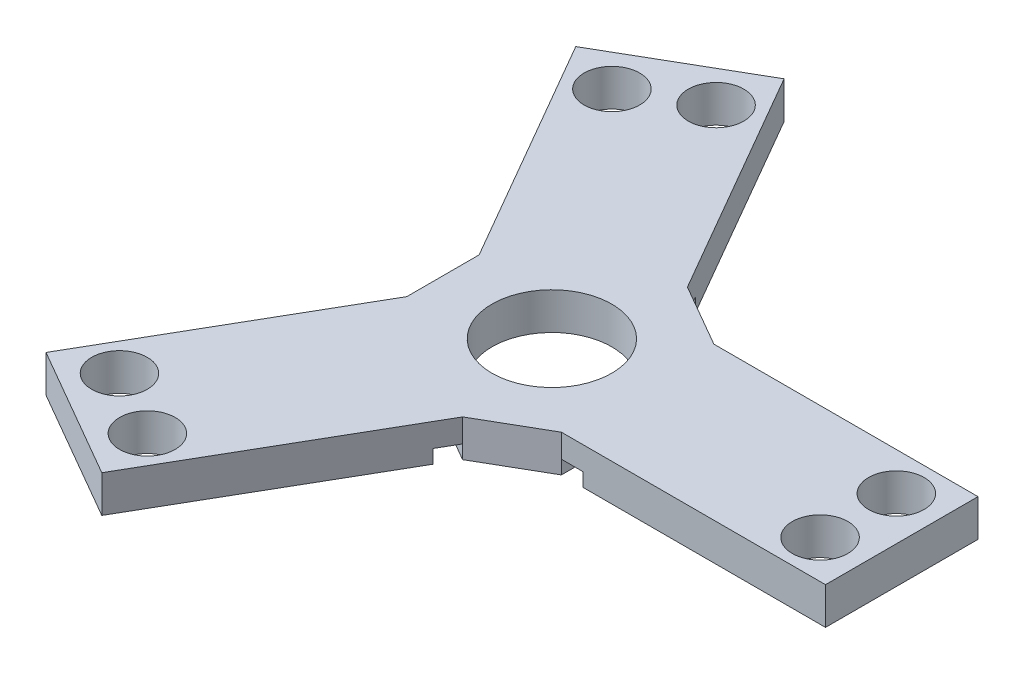
ISO-10303-21;
HEADER;
FILE_DESCRIPTION(('STEP AP214'),'2;1');
FILE_NAME('part.step','',(''),(''),'','','');
FILE_SCHEMA(('AUTOMOTIVE_DESIGN { 1 0 10303 214 1 1 1 1 }'));
ENDSEC;
DATA;
#1=APPLICATION_CONTEXT('core data for automotive mechanical design processes');
#2=APPLICATION_PROTOCOL_DEFINITION('international standard','automotive_design',2000,#1);
#3=PRODUCT_CONTEXT('',#1,'mechanical');
#4=PRODUCT('Part','Part','',(#3));
#5=PRODUCT_RELATED_PRODUCT_CATEGORY('part','',(#4));
#6=PRODUCT_DEFINITION_FORMATION('','',#4);
#7=PRODUCT_DEFINITION_CONTEXT('part definition',#1,'design');
#8=PRODUCT_DEFINITION('design','',#6,#7);
#9=PRODUCT_DEFINITION_SHAPE('','',#8);
#10=(LENGTH_UNIT() NAMED_UNIT(*) SI_UNIT(.MILLI.,.METRE.));
#11=(NAMED_UNIT(*) PLANE_ANGLE_UNIT() SI_UNIT($,.RADIAN.));
#12=(NAMED_UNIT(*) SI_UNIT($,.STERADIAN.) SOLID_ANGLE_UNIT());
#13=UNCERTAINTY_MEASURE_WITH_UNIT(LENGTH_MEASURE(1.E-05),#10,'distance_accuracy_value','');
#14=(GEOMETRIC_REPRESENTATION_CONTEXT(3) GLOBAL_UNCERTAINTY_ASSIGNED_CONTEXT((#13)) GLOBAL_UNIT_ASSIGNED_CONTEXT((#10,
#11,#12)) REPRESENTATION_CONTEXT('',''));
#15=CARTESIAN_POINT('',(0.,0.,0.));
#16=DIRECTION('',(0.,0.,1.));
#17=DIRECTION('',(1.,0.,0.));
#18=AXIS2_PLACEMENT_3D('',#15,#16,#17);
#19=CARTESIAN_POINT('',(0.,0.,0.));
#20=DIRECTION('',(0.,1.,0.));
#21=DIRECTION('',(0.,0.,1.));
#22=AXIS2_PLACEMENT_3D('',#19,#20,#21);
#23=PLANE('',#22);
#24=CARTESIAN_POINT('',(0.,0.,0.));
#25=DIRECTION('',(0.,1.,0.));
#26=DIRECTION('',(0.,0.,1.));
#27=AXIS2_PLACEMENT_3D('',#24,#25,#26);
#28=CIRCLE('',#27,5.5);
#29=CARTESIAN_POINT('',(0.,0.,5.5));
#30=VERTEX_POINT('',#29);
#31=EDGE_CURVE('E346',#30,#30,#28,.T.);
#32=ORIENTED_EDGE('',*,*,#31,.T.);
#33=EDGE_LOOP('',(#32));
#34=FACE_BOUND('',#33,.T.);
#35=DIRECTION('',(-0.866025403784438,0.,-0.5));
#36=VECTOR('',#35,1.);
#37=CARTESIAN_POINT('',(5.,0.,-8.66025403784438));
#38=LINE('',#37,#36);
#39=CARTESIAN_POINT('',(7.87564434701785,0.,-7.));
#40=VERTEX_POINT('',#39);
#41=CARTESIAN_POINT('',(2.12435565298215,0.,-10.3205080756888));
#42=VERTEX_POINT('',#41);
#43=EDGE_CURVE('E418',#40,#42,#38,.T.);
#44=ORIENTED_EDGE('',*,*,#43,.F.);
#45=DIRECTION('',(0.,0.,-1.));
#46=VECTOR('',#45,1.);
#47=CARTESIAN_POINT('',(7.87564434701785,0.,-7.));
#48=LINE('',#47,#46);
#49=CARTESIAN_POINT('',(7.87564434701785,0.,7.));
#50=VERTEX_POINT('',#49);
#51=EDGE_CURVE('E204',#50,#40,#48,.T.);
#52=ORIENTED_EDGE('',*,*,#51,.F.);
#53=DIRECTION('',(0.866025403784438,0.,-0.5));
#54=VECTOR('',#53,1.);
#55=CARTESIAN_POINT('',(5.,0.,8.66025403784438));
#56=LINE('',#55,#54);
#57=CARTESIAN_POINT('',(2.12435565298214,0.,10.3205080756888));
#58=VERTEX_POINT('',#57);
#59=EDGE_CURVE('E405',#58,#50,#56,.T.);
#60=ORIENTED_EDGE('',*,*,#59,.F.);
#61=DIRECTION('',(0.866025403784438,0.,0.500000000000001));
#62=VECTOR('',#61,1.);
#63=CARTESIAN_POINT('',(2.12435565298214,0.,10.3205080756888));
#64=LINE('',#63,#62);
#65=CARTESIAN_POINT('',(-10.,0.,3.32050807568876));
#66=VERTEX_POINT('',#65);
#67=EDGE_CURVE('E275',#66,#58,#64,.T.);
#68=ORIENTED_EDGE('',*,*,#67,.F.);
#69=DIRECTION('',(0.,0.,1.));
#70=VECTOR('',#69,1.);
#71=CARTESIAN_POINT('',(-9.99999999999999,0.,0.));
#72=LINE('',#71,#70);
#73=CARTESIAN_POINT('',(-9.99999999999999,0.,-3.32050807568877));
#74=VERTEX_POINT('',#73);
#75=EDGE_CURVE('E391',#74,#66,#72,.T.);
#76=ORIENTED_EDGE('',*,*,#75,.F.);
#77=DIRECTION('',(-0.866025403784439,0.,0.5));
#78=VECTOR('',#77,1.);
#79=CARTESIAN_POINT('',(-9.99999999999999,0.,-3.32050807568877));
#80=LINE('',#79,#78);
#81=EDGE_CURVE('E237',#42,#74,#80,.T.);
#82=ORIENTED_EDGE('',*,*,#81,.F.);
#83=EDGE_LOOP('',(#44,#52,#60,#68,#76,#82));
#84=FACE_BOUND('',#83,.T.);
#85=ADVANCED_FACE('F43',(#34,#84),#23,.F.);
#86=CARTESIAN_POINT('',(28.1243556529821,0.,3.5));
#87=DIRECTION('',(0.,1.,0.));
#88=DIRECTION('',(0.,0.,-1.));
#89=AXIS2_PLACEMENT_3D('',#86,#87,#88);
#90=CIRCLE('',#89,2.55);
#91=CARTESIAN_POINT('',(28.1243556529821,0.,0.950000000000001));
#92=VERTEX_POINT('',#91);
#93=EDGE_CURVE('E301',#92,#92,#90,.T.);
#94=ORIENTED_EDGE('',*,*,#93,.T.);
#95=EDGE_LOOP('',(#94));
#96=FACE_BOUND('',#95,.T.);
#97=CARTESIAN_POINT('',(28.1243556529821,0.,-3.5));
#98=DIRECTION('',(0.,1.,0.));
#99=DIRECTION('',(0.,0.,1.));
#100=AXIS2_PLACEMENT_3D('',#97,#98,#99);
#101=CIRCLE('',#100,2.55);
#102=CARTESIAN_POINT('',(28.1243556529821,0.,-0.950000000000001));
#103=VERTEX_POINT('',#102);
#104=EDGE_CURVE('E333',#103,#103,#101,.T.);
#105=ORIENTED_EDGE('',*,*,#104,.T.);
#106=EDGE_LOOP('',(#105));
#107=FACE_BOUND('',#106,.T.);
#108=DIRECTION('',(1.,0.,0.));
#109=VECTOR('',#108,1.);
#110=CARTESIAN_POINT('',(0.,0.,7.));
#111=LINE('',#110,#109);
#112=CARTESIAN_POINT('',(9.87564434701786,0.,7.));
#113=VERTEX_POINT('',#112);
#114=CARTESIAN_POINT('',(32.1243556529821,0.,7.));
#115=VERTEX_POINT('',#114);
#116=EDGE_CURVE('E409',#113,#115,#111,.T.);
#117=ORIENTED_EDGE('',*,*,#116,.F.);
#118=DIRECTION('',(0.,0.,1.));
#119=VECTOR('',#118,1.);
#120=CARTESIAN_POINT('',(9.87564434701786,0.,7.));
#121=LINE('',#120,#119);
#122=CARTESIAN_POINT('',(9.87564434701786,0.,-7.));
#123=VERTEX_POINT('',#122);
#124=EDGE_CURVE('E246',#123,#113,#121,.T.);
#125=ORIENTED_EDGE('',*,*,#124,.F.);
#126=DIRECTION('',(1.,0.,0.));
#127=VECTOR('',#126,1.);
#128=CARTESIAN_POINT('',(0.,0.,-7.));
#129=LINE('',#128,#127);
#130=CARTESIAN_POINT('',(32.1243556529821,0.,-7.));
#131=VERTEX_POINT('',#130);
#132=EDGE_CURVE('E209',#123,#131,#129,.T.);
#133=ORIENTED_EDGE('',*,*,#132,.T.);
#134=DIRECTION('',(0.,0.,1.));
#135=VECTOR('',#134,1.);
#136=CARTESIAN_POINT('',(32.1243556529821,0.,0.));
#137=LINE('',#136,#135);
#138=EDGE_CURVE('E412',#131,#115,#137,.T.);
#139=ORIENTED_EDGE('',*,*,#138,.T.);
#140=EDGE_LOOP('',(#117,#125,#133,#139));
#141=FACE_BOUND('',#140,.T.);
#142=ADVANCED_FACE('F542',(#96,#107,#141),#23,.F.);
#143=CARTESIAN_POINT('',(-11.0310889132455,0.,-26.106406460551));
#144=DIRECTION('',(0.,1.,0.));
#145=DIRECTION('',(0.,0.,-1.));
#146=AXIS2_PLACEMENT_3D('',#143,#144,#145);
#147=CIRCLE('',#146,2.55);
#148=CARTESIAN_POINT('',(-11.0310889132455,0.,-28.656406460551));
#149=VERTEX_POINT('',#148);
#150=EDGE_CURVE('E291',#149,#149,#147,.T.);
#151=ORIENTED_EDGE('',*,*,#150,.T.);
#152=EDGE_LOOP('',(#151));
#153=FACE_BOUND('',#152,.T.);
#154=CARTESIAN_POINT('',(-17.0932667397366,0.,-22.606406460551));
#155=DIRECTION('',(0.,1.,0.));
#156=DIRECTION('',(0.,0.,1.));
#157=AXIS2_PLACEMENT_3D('',#154,#155,#156);
#158=CIRCLE('',#157,2.55);
#159=CARTESIAN_POINT('',(-17.0932667397366,0.,-20.056406460551));
#160=VERTEX_POINT('',#159);
#161=EDGE_CURVE('E326',#160,#160,#158,.T.);
#162=ORIENTED_EDGE('',*,*,#161,.T.);
#163=EDGE_LOOP('',(#162));
#164=FACE_BOUND('',#163,.T.);
#165=DIRECTION('',(-0.5,0.,-0.866025403784438));
#166=VECTOR('',#165,1.);
#167=CARTESIAN_POINT('',(6.06217782649107,0.,-3.5));
#168=LINE('',#167,#166);
#169=CARTESIAN_POINT('',(1.12435565298215,0.,-12.0525588832576));
#170=VERTEX_POINT('',#169);
#171=CARTESIAN_POINT('',(-9.99999999999999,0.,-31.3205080756887));
#172=VERTEX_POINT('',#171);
#173=EDGE_CURVE('E422',#170,#172,#168,.T.);
#174=ORIENTED_EDGE('',*,*,#173,.F.);
#175=DIRECTION('',(0.866025403784439,0.,-0.5));
#176=VECTOR('',#175,1.);
#177=CARTESIAN_POINT('',(1.12435565298215,0.,-12.0525588832576));
#178=LINE('',#177,#176);
#179=CARTESIAN_POINT('',(-11.,0.,-5.05255888325765));
#180=VERTEX_POINT('',#179);
#181=EDGE_CURVE('E224',#180,#170,#178,.T.);
#182=ORIENTED_EDGE('',*,*,#181,.F.);
#183=DIRECTION('',(-0.5,0.,-0.866025403784438));
#184=VECTOR('',#183,1.);
#185=CARTESIAN_POINT('',(-6.06217782649107,0.,3.5));
#186=LINE('',#185,#184);
#187=CARTESIAN_POINT('',(-22.1243556529821,0.,-24.3205080756887));
#188=VERTEX_POINT('',#187);
#189=EDGE_CURVE('E337',#180,#188,#186,.T.);
#190=ORIENTED_EDGE('',*,*,#189,.T.);
#191=DIRECTION('',(0.866025403784438,0.,-0.5));
#192=VECTOR('',#191,1.);
#193=CARTESIAN_POINT('',(-16.0621778264911,0.,-27.8205080756887));
#194=LINE('',#193,#192);
#195=EDGE_CURVE('E425',#188,#172,#194,.T.);
#196=ORIENTED_EDGE('',*,*,#195,.T.);
#197=EDGE_LOOP('',(#174,#182,#190,#196));
#198=FACE_BOUND('',#197,.T.);
#199=ADVANCED_FACE('F569',(#153,#164,#198),#23,.F.);
#200=CARTESIAN_POINT('',(-6.06217782649107,3.4,3.5));
#201=DIRECTION('',(-0.866025403784438,0.,0.5));
#202=DIRECTION('',(0.5,0.,0.866025403784439));
#203=AXIS2_PLACEMENT_3D('',#200,#201,#202);
#204=PLANE('',#203);
#205=DIRECTION('',(0.,-1.,0.));
#206=VECTOR('',#205,1.);
#207=CARTESIAN_POINT('',(-11.,1.25,-5.05255888325765));
#208=LINE('',#207,#206);
#209=CARTESIAN_POINT('',(-11.,1.25,-5.05255888325765));
#210=VERTEX_POINT('',#209);
#211=EDGE_CURVE('E251',#210,#180,#208,.T.);
#212=ORIENTED_EDGE('',*,*,#211,.F.);
#213=DIRECTION('',(-0.5,0.,-0.866025403784439));
#214=VECTOR('',#213,1.);
#215=CARTESIAN_POINT('',(-11.,1.25,-5.05255888325765));
#216=LINE('',#215,#214);
#217=CARTESIAN_POINT('',(-9.99999999999999,1.25,-3.32050807568877));
#218=VERTEX_POINT('',#217);
#219=EDGE_CURVE('E223',#218,#210,#216,.T.);
#220=ORIENTED_EDGE('',*,*,#219,.F.);
#221=DIRECTION('',(0.,-1.,0.));
#222=VECTOR('',#221,1.);
#223=CARTESIAN_POINT('',(-9.99999999999999,3.4,-3.32050807568876));
#224=LINE('',#223,#222);
#225=CARTESIAN_POINT('',(-9.99999999999999,3.4,-3.32050807568876));
#226=VERTEX_POINT('',#225);
#227=EDGE_CURVE('E11',#226,#218,#224,.T.);
#228=ORIENTED_EDGE('',*,*,#227,.F.);
#229=DIRECTION('',(-0.5,0.,-0.866025403784438));
#230=VECTOR('',#229,1.);
#231=CARTESIAN_POINT('',(-6.06217782649107,3.4,3.5));
#232=LINE('',#231,#230);
#233=CARTESIAN_POINT('',(-22.1243556529821,3.4,-24.3205080756887));
#234=VERTEX_POINT('',#233);
#235=EDGE_CURVE('E341',#226,#234,#232,.T.);
#236=ORIENTED_EDGE('',*,*,#235,.T.);
#237=DIRECTION('',(0.,-1.,0.));
#238=VECTOR('',#237,1.);
#239=CARTESIAN_POINT('',(-22.1243556529821,3.4,-24.3205080756887));
#240=LINE('',#239,#238);
#241=EDGE_CURVE('E388',#234,#188,#240,.T.);
#242=ORIENTED_EDGE('',*,*,#241,.T.);
#243=ORIENTED_EDGE('',*,*,#189,.F.);
#244=EDGE_LOOP('',(#212,#220,#228,#236,#242,#243));
#245=FACE_BOUND('',#244,.T.);
#246=ADVANCED_FACE('F45',(#245),#204,.T.);
#247=CARTESIAN_POINT('',(-9.99999999999999,3.4,0.));
#248=DIRECTION('',(1.,0.,0.));
#249=DIRECTION('',(0.,0.,-1.));
#250=AXIS2_PLACEMENT_3D('',#247,#248,#249);
#251=PLANE('',#250);
#252=ORIENTED_EDGE('',*,*,#75,.T.);
#253=DIRECTION('',(0.,-1.,0.));
#254=VECTOR('',#253,1.);
#255=CARTESIAN_POINT('',(-10.,1.25,3.32050807568876));
#256=LINE('',#255,#254);
#257=CARTESIAN_POINT('',(-10.,1.25,3.32050807568876));
#258=VERTEX_POINT('',#257);
#259=EDGE_CURVE('E240',#258,#66,#256,.T.);
#260=ORIENTED_EDGE('',*,*,#259,.F.);
#261=DIRECTION('',(0.,-1.,0.));
#262=VECTOR('',#261,1.);
#263=CARTESIAN_POINT('',(-9.99999999999999,3.4,3.32050807568876));
#264=LINE('',#263,#262);
#265=CARTESIAN_POINT('',(-9.99999999999999,3.4,3.32050807568876));
#266=VERTEX_POINT('',#265);
#267=EDGE_CURVE('E52',#266,#258,#264,.T.);
#268=ORIENTED_EDGE('',*,*,#267,.F.);
#269=DIRECTION('',(0.,0.,1.));
#270=VECTOR('',#269,1.);
#271=CARTESIAN_POINT('',(-9.99999999999999,3.4,0.));
#272=LINE('',#271,#270);
#273=EDGE_CURVE('E345',#226,#266,#272,.T.);
#274=ORIENTED_EDGE('',*,*,#273,.F.);
#275=ORIENTED_EDGE('',*,*,#227,.T.);
#276=DIRECTION('',(0.,-1.,0.));
#277=VECTOR('',#276,1.);
#278=CARTESIAN_POINT('',(-9.99999999999999,1.25,-3.32050807568877));
#279=LINE('',#278,#277);
#280=EDGE_CURVE('E236',#218,#74,#279,.T.);
#281=ORIENTED_EDGE('',*,*,#280,.T.);
#282=EDGE_LOOP('',(#252,#260,#268,#274,#275,#281));
#283=FACE_BOUND('',#282,.T.);
#284=ADVANCED_FACE('F479',(#283),#251,.F.);
#285=CARTESIAN_POINT('',(-6.06217782649107,3.4,-3.5));
#286=DIRECTION('',(0.866025403784439,0.,0.5));
#287=DIRECTION('',(0.5,0.,-0.866025403784439));
#288=AXIS2_PLACEMENT_3D('',#285,#286,#287);
#289=PLANE('',#288);
#290=DIRECTION('',(0.5,0.,-0.866025403784439));
#291=VECTOR('',#290,1.);
#292=CARTESIAN_POINT('',(-10.,1.25,3.32050807568876));
#293=LINE('',#292,#291);
#294=CARTESIAN_POINT('',(-11.,1.25,5.05255888325764));
#295=VERTEX_POINT('',#294);
#296=EDGE_CURVE('E270',#295,#258,#293,.T.);
#297=ORIENTED_EDGE('',*,*,#296,.F.);
#298=DIRECTION('',(0.,-1.,0.));
#299=VECTOR('',#298,1.);
#300=CARTESIAN_POINT('',(-11.,1.25,5.05255888325764));
#301=LINE('',#300,#299);
#302=CARTESIAN_POINT('',(-11.,0.,5.05255888325764));
#303=VERTEX_POINT('',#302);
#304=EDGE_CURVE('E282',#295,#303,#301,.T.);
#305=ORIENTED_EDGE('',*,*,#304,.T.);
#306=DIRECTION('',(-0.5,0.,0.866025403784439));
#307=VECTOR('',#306,1.);
#308=CARTESIAN_POINT('',(-6.06217782649107,0.,-3.5));
#309=LINE('',#308,#307);
#310=CARTESIAN_POINT('',(-22.1243556529821,0.,24.3205080756887));
#311=VERTEX_POINT('',#310);
#312=EDGE_CURVE('E395',#303,#311,#309,.T.);
#313=ORIENTED_EDGE('',*,*,#312,.T.);
#314=DIRECTION('',(0.,-1.,0.));
#315=VECTOR('',#314,1.);
#316=CARTESIAN_POINT('',(-22.1243556529821,3.4,24.3205080756887));
#317=LINE('',#316,#315);
#318=CARTESIAN_POINT('',(-22.1243556529821,3.4,24.3205080756887));
#319=VERTEX_POINT('',#318);
#320=EDGE_CURVE('E465',#319,#311,#317,.T.);
#321=ORIENTED_EDGE('',*,*,#320,.F.);
#322=DIRECTION('',(-0.5,0.,0.866025403784439));
#323=VECTOR('',#322,1.);
#324=CARTESIAN_POINT('',(-6.06217782649107,3.4,-3.5));
#325=LINE('',#324,#323);
#326=EDGE_CURVE('E349',#266,#319,#325,.T.);
#327=ORIENTED_EDGE('',*,*,#326,.F.);
#328=ORIENTED_EDGE('',*,*,#267,.T.);
#329=EDGE_LOOP('',(#297,#305,#313,#321,#327,#328));
#330=FACE_BOUND('',#329,.T.);
#331=ADVANCED_FACE('F474',(#330),#289,.F.);
#332=CARTESIAN_POINT('',(-16.062177826491,3.4,27.8205080756888));
#333=DIRECTION('',(-0.5,0.,0.866025403784439));
#334=DIRECTION('',(0.866025403784439,0.,0.5));
#335=AXIS2_PLACEMENT_3D('',#332,#333,#334);
#336=PLANE('',#335);
#337=DIRECTION('',(-0.866025403784439,0.,-0.5));
#338=VECTOR('',#337,1.);
#339=CARTESIAN_POINT('',(-16.062177826491,0.,27.8205080756888));
#340=LINE('',#339,#338);
#341=CARTESIAN_POINT('',(-9.99999999999998,0.,31.3205080756887));
#342=VERTEX_POINT('',#341);
#343=EDGE_CURVE('E398',#342,#311,#340,.T.);
#344=ORIENTED_EDGE('',*,*,#343,.F.);
#345=DIRECTION('',(0.,-1.,0.));
#346=VECTOR('',#345,1.);
#347=CARTESIAN_POINT('',(-9.99999999999998,3.4,31.3205080756887));
#348=LINE('',#347,#346);
#349=CARTESIAN_POINT('',(-9.99999999999998,3.4,31.3205080756887));
#350=VERTEX_POINT('',#349);
#351=EDGE_CURVE('E461',#350,#342,#348,.T.);
#352=ORIENTED_EDGE('',*,*,#351,.F.);
#353=DIRECTION('',(-0.866025403784439,0.,-0.5));
#354=VECTOR('',#353,1.);
#355=CARTESIAN_POINT('',(-16.062177826491,3.4,27.8205080756888));
#356=LINE('',#355,#354);
#357=EDGE_CURVE('E352',#350,#319,#356,.T.);
#358=ORIENTED_EDGE('',*,*,#357,.T.);
#359=ORIENTED_EDGE('',*,*,#320,.T.);
#360=EDGE_LOOP('',(#344,#352,#358,#359));
#361=FACE_BOUND('',#360,.T.);
#362=ADVANCED_FACE('F507',(#361),#336,.T.);
#363=CARTESIAN_POINT('',(6.06217782649107,3.4,3.5));
#364=DIRECTION('',(0.866025403784439,0.,0.5));
#365=DIRECTION('',(0.5,0.,-0.866025403784439));
#366=AXIS2_PLACEMENT_3D('',#363,#364,#365);
#367=PLANE('',#366);
#368=DIRECTION('',(0.,-1.,0.));
#369=VECTOR('',#368,1.);
#370=CARTESIAN_POINT('',(1.12435565298214,1.25,12.0525588832576));
#371=LINE('',#370,#369);
#372=CARTESIAN_POINT('',(1.12435565298214,1.25,12.0525588832576));
#373=VERTEX_POINT('',#372);
#374=CARTESIAN_POINT('',(1.12435565298214,0.,12.0525588832576));
#375=VERTEX_POINT('',#374);
#376=EDGE_CURVE('E59',#373,#375,#371,.T.);
#377=ORIENTED_EDGE('',*,*,#376,.F.);
#378=DIRECTION('',(-0.500000000000001,0.,0.866025403784438));
#379=VECTOR('',#378,1.);
#380=CARTESIAN_POINT('',(1.12435565298214,1.25,12.0525588832576));
#381=LINE('',#380,#379);
#382=CARTESIAN_POINT('',(2.12435565298214,1.25,10.3205080756888));
#383=VERTEX_POINT('',#382);
#384=EDGE_CURVE('E261',#383,#373,#381,.T.);
#385=ORIENTED_EDGE('',*,*,#384,.F.);
#386=DIRECTION('',(0.,-1.,0.));
#387=VECTOR('',#386,1.);
#388=CARTESIAN_POINT('',(2.12435565298216,3.4,10.3205080756888));
#389=LINE('',#388,#387);
#390=CARTESIAN_POINT('',(2.12435565298216,3.4,10.3205080756888));
#391=VERTEX_POINT('',#390);
#392=EDGE_CURVE('E457',#391,#383,#389,.T.);
#393=ORIENTED_EDGE('',*,*,#392,.F.);
#394=DIRECTION('',(-0.5,0.,0.866025403784439));
#395=VECTOR('',#394,1.);
#396=CARTESIAN_POINT('',(6.06217782649107,3.4,3.5));
#397=LINE('',#396,#395);
#398=EDGE_CURVE('E356',#391,#350,#397,.T.);
#399=ORIENTED_EDGE('',*,*,#398,.T.);
#400=ORIENTED_EDGE('',*,*,#351,.T.);
#401=DIRECTION('',(-0.5,0.,0.866025403784439));
#402=VECTOR('',#401,1.);
#403=CARTESIAN_POINT('',(6.06217782649107,0.,3.5));
#404=LINE('',#403,#402);
#405=EDGE_CURVE('E402',#375,#342,#404,.T.);
#406=ORIENTED_EDGE('',*,*,#405,.F.);
#407=EDGE_LOOP('',(#377,#385,#393,#399,#400,#406));
#408=FACE_BOUND('',#407,.T.);
#409=ADVANCED_FACE('F499',(#408),#367,.T.);
#410=CARTESIAN_POINT('',(5.,3.4,8.66025403784438));
#411=DIRECTION('',(-0.5,0.,-0.866025403784438));
#412=DIRECTION('',(-0.866025403784438,0.,0.5));
#413=AXIS2_PLACEMENT_3D('',#410,#411,#412);
#414=PLANE('',#413);
#415=ORIENTED_EDGE('',*,*,#59,.T.);
#416=DIRECTION('',(0.,-1.,0.));
#417=VECTOR('',#416,1.);
#418=CARTESIAN_POINT('',(7.87564434701785,1.25,7.));
#419=LINE('',#418,#417);
#420=CARTESIAN_POINT('',(7.87564434701785,1.25,7.));
#421=VERTEX_POINT('',#420);
#422=EDGE_CURVE('E214',#421,#50,#419,.T.);
#423=ORIENTED_EDGE('',*,*,#422,.F.);
#424=DIRECTION('',(0.,-1.,0.));
#425=VECTOR('',#424,1.);
#426=CARTESIAN_POINT('',(7.87564434701785,3.4,7.));
#427=LINE('',#426,#425);
#428=CARTESIAN_POINT('',(7.87564434701785,3.4,7.));
#429=VERTEX_POINT('',#428);
#430=EDGE_CURVE('E453',#429,#421,#427,.T.);
#431=ORIENTED_EDGE('',*,*,#430,.F.);
#432=DIRECTION('',(0.866025403784438,0.,-0.5));
#433=VECTOR('',#432,1.);
#434=CARTESIAN_POINT('',(5.,3.4,8.66025403784438));
#435=LINE('',#434,#433);
#436=EDGE_CURVE('E360',#391,#429,#435,.T.);
#437=ORIENTED_EDGE('',*,*,#436,.F.);
#438=ORIENTED_EDGE('',*,*,#392,.T.);
#439=DIRECTION('',(0.,-1.,0.));
#440=VECTOR('',#439,1.);
#441=CARTESIAN_POINT('',(2.12435565298214,1.25,10.3205080756888));
#442=LINE('',#441,#440);
#443=EDGE_CURVE('E274',#383,#58,#442,.T.);
#444=ORIENTED_EDGE('',*,*,#443,.T.);
#445=EDGE_LOOP('',(#415,#423,#431,#437,#438,#444));
#446=FACE_BOUND('',#445,.T.);
#447=ADVANCED_FACE('F492',(#446),#414,.F.);
#448=CARTESIAN_POINT('',(0.,3.4,7.));
#449=DIRECTION('',(0.,0.,-1.));
#450=DIRECTION('',(-1.,0.,0.));
#451=AXIS2_PLACEMENT_3D('',#448,#449,#450);
#452=PLANE('',#451);
#453=DIRECTION('',(-1.,0.,0.));
#454=VECTOR('',#453,1.);
#455=CARTESIAN_POINT('',(7.87564434701785,1.25,7.));
#456=LINE('',#455,#454);
#457=CARTESIAN_POINT('',(9.87564434701786,1.25,7.));
#458=VERTEX_POINT('',#457);
#459=EDGE_CURVE('E193',#458,#421,#456,.T.);
#460=ORIENTED_EDGE('',*,*,#459,.F.);
#461=DIRECTION('',(0.,-1.,0.));
#462=VECTOR('',#461,1.);
#463=CARTESIAN_POINT('',(9.87564434701786,1.25,7.));
#464=LINE('',#463,#462);
#465=EDGE_CURVE('E189',#458,#113,#464,.T.);
#466=ORIENTED_EDGE('',*,*,#465,.T.);
#467=ORIENTED_EDGE('',*,*,#116,.T.);
#468=DIRECTION('',(0.,-1.,0.));
#469=VECTOR('',#468,1.);
#470=CARTESIAN_POINT('',(32.1243556529821,3.4,7.));
#471=LINE('',#470,#469);
#472=CARTESIAN_POINT('',(32.1243556529821,3.4,7.));
#473=VERTEX_POINT('',#472);
#474=EDGE_CURVE('E449',#473,#115,#471,.T.);
#475=ORIENTED_EDGE('',*,*,#474,.F.);
#476=DIRECTION('',(1.,0.,0.));
#477=VECTOR('',#476,1.);
#478=CARTESIAN_POINT('',(0.,3.4,7.));
#479=LINE('',#478,#477);
#480=EDGE_CURVE('E363',#429,#473,#479,.T.);
#481=ORIENTED_EDGE('',*,*,#480,.F.);
#482=ORIENTED_EDGE('',*,*,#430,.T.);
#483=EDGE_LOOP('',(#460,#466,#467,#475,#481,#482));
#484=FACE_BOUND('',#483,.T.);
#485=ADVANCED_FACE('F614',(#484),#452,.F.);
#486=CARTESIAN_POINT('',(32.1243556529821,3.4,0.));
#487=DIRECTION('',(1.,0.,0.));
#488=DIRECTION('',(0.,0.,-1.));
#489=AXIS2_PLACEMENT_3D('',#486,#487,#488);
#490=PLANE('',#489);
#491=ORIENTED_EDGE('',*,*,#138,.F.);
#492=DIRECTION('',(0.,-1.,0.));
#493=VECTOR('',#492,1.);
#494=CARTESIAN_POINT('',(32.1243556529821,3.4,-7.));
#495=LINE('',#494,#493);
#496=CARTESIAN_POINT('',(32.1243556529821,3.4,-7.));
#497=VERTEX_POINT('',#496);
#498=EDGE_CURVE('E446',#497,#131,#495,.T.);
#499=ORIENTED_EDGE('',*,*,#498,.F.);
#500=DIRECTION('',(0.,0.,1.));
#501=VECTOR('',#500,1.);
#502=CARTESIAN_POINT('',(32.1243556529821,3.4,0.));
#503=LINE('',#502,#501);
#504=EDGE_CURVE('E366',#497,#473,#503,.T.);
#505=ORIENTED_EDGE('',*,*,#504,.T.);
#506=ORIENTED_EDGE('',*,*,#474,.T.);
#507=EDGE_LOOP('',(#491,#499,#505,#506));
#508=FACE_BOUND('',#507,.T.);
#509=ADVANCED_FACE('F538',(#508),#490,.T.);
#510=CARTESIAN_POINT('',(0.,3.4,-7.));
#511=DIRECTION('',(0.,0.,-1.));
#512=DIRECTION('',(-1.,0.,0.));
#513=AXIS2_PLACEMENT_3D('',#510,#511,#512);
#514=PLANE('',#513);
#515=DIRECTION('',(0.,-1.,0.));
#516=VECTOR('',#515,1.);
#517=CARTESIAN_POINT('',(9.87564434701786,1.25,-7.));
#518=LINE('',#517,#516);
#519=CARTESIAN_POINT('',(9.87564434701786,1.25,-7.));
#520=VERTEX_POINT('',#519);
#521=EDGE_CURVE('E67',#520,#123,#518,.T.);
#522=ORIENTED_EDGE('',*,*,#521,.F.);
#523=DIRECTION('',(1.,0.,0.));
#524=VECTOR('',#523,1.);
#525=CARTESIAN_POINT('',(9.87564434701786,1.25,-7.));
#526=LINE('',#525,#524);
#527=CARTESIAN_POINT('',(7.87564434701785,1.25,-7.));
#528=VERTEX_POINT('',#527);
#529=EDGE_CURVE('E194',#528,#520,#526,.T.);
#530=ORIENTED_EDGE('',*,*,#529,.F.);
#531=DIRECTION('',(0.,-1.,0.));
#532=VECTOR('',#531,1.);
#533=CARTESIAN_POINT('',(7.87564434701785,3.4,-7.));
#534=LINE('',#533,#532);
#535=CARTESIAN_POINT('',(7.87564434701785,3.4,-7.));
#536=VERTEX_POINT('',#535);
#537=EDGE_CURVE('E443',#536,#528,#534,.T.);
#538=ORIENTED_EDGE('',*,*,#537,.F.);
#539=DIRECTION('',(1.,0.,0.));
#540=VECTOR('',#539,1.);
#541=CARTESIAN_POINT('',(0.,3.4,-7.));
#542=LINE('',#541,#540);
#543=EDGE_CURVE('E370',#536,#497,#542,.T.);
#544=ORIENTED_EDGE('',*,*,#543,.T.);
#545=ORIENTED_EDGE('',*,*,#498,.T.);
#546=ORIENTED_EDGE('',*,*,#132,.F.);
#547=EDGE_LOOP('',(#522,#530,#538,#544,#545,#546));
#548=FACE_BOUND('',#547,.T.);
#549=ADVANCED_FACE('F207',(#548),#514,.T.);
#550=CARTESIAN_POINT('',(5.,3.4,-8.66025403784438));
#551=DIRECTION('',(-0.5,0.,0.866025403784438));
#552=DIRECTION('',(0.866025403784439,0.,0.5));
#553=AXIS2_PLACEMENT_3D('',#550,#551,#552);
#554=PLANE('',#553);
#555=ORIENTED_EDGE('',*,*,#43,.T.);
#556=DIRECTION('',(0.,-1.,0.));
#557=VECTOR('',#556,1.);
#558=CARTESIAN_POINT('',(2.12435565298215,1.25,-10.3205080756888));
#559=LINE('',#558,#557);
#560=CARTESIAN_POINT('',(2.12435565298215,1.25,-10.3205080756888));
#561=VERTEX_POINT('',#560);
#562=EDGE_CURVE('E243',#561,#42,#559,.T.);
#563=ORIENTED_EDGE('',*,*,#562,.F.);
#564=DIRECTION('',(0.,-1.,0.));
#565=VECTOR('',#564,1.);
#566=CARTESIAN_POINT('',(2.12435565298214,3.4,-10.3205080756888));
#567=LINE('',#566,#565);
#568=CARTESIAN_POINT('',(2.12435565298214,3.4,-10.3205080756888));
#569=VERTEX_POINT('',#568);
#570=EDGE_CURVE('E439',#569,#561,#567,.T.);
#571=ORIENTED_EDGE('',*,*,#570,.F.);
#572=DIRECTION('',(-0.866025403784438,0.,-0.5));
#573=VECTOR('',#572,1.);
#574=CARTESIAN_POINT('',(5.,3.4,-8.66025403784438));
#575=LINE('',#574,#573);
#576=EDGE_CURVE('E374',#536,#569,#575,.T.);
#577=ORIENTED_EDGE('',*,*,#576,.F.);
#578=ORIENTED_EDGE('',*,*,#537,.T.);
#579=DIRECTION('',(0.,-1.,0.));
#580=VECTOR('',#579,1.);
#581=CARTESIAN_POINT('',(7.87564434701785,1.25,-7.));
#582=LINE('',#581,#580);
#583=EDGE_CURVE('E300',#528,#40,#582,.T.);
#584=ORIENTED_EDGE('',*,*,#583,.T.);
#585=EDGE_LOOP('',(#555,#563,#571,#577,#578,#584));
#586=FACE_BOUND('',#585,.T.);
#587=ADVANCED_FACE('F528',(#586),#554,.F.);
#588=CARTESIAN_POINT('',(6.06217782649107,3.4,-3.5));
#589=DIRECTION('',(-0.866025403784438,0.,0.5));
#590=DIRECTION('',(0.5,0.,0.866025403784439));
#591=AXIS2_PLACEMENT_3D('',#588,#589,#590);
#592=PLANE('',#591);
#593=DIRECTION('',(0.5,0.,0.866025403784438));
#594=VECTOR('',#593,1.);
#595=CARTESIAN_POINT('',(2.12435565298215,1.25,-10.3205080756888));
#596=LINE('',#595,#594);
#597=CARTESIAN_POINT('',(1.12435565298215,1.25,-12.0525588832576));
#598=VERTEX_POINT('',#597);
#599=EDGE_CURVE('E232',#598,#561,#596,.T.);
#600=ORIENTED_EDGE('',*,*,#599,.F.);
#601=DIRECTION('',(0.,-1.,0.));
#602=VECTOR('',#601,1.);
#603=CARTESIAN_POINT('',(1.12435565298215,1.25,-12.0525588832576));
#604=LINE('',#603,#602);
#605=EDGE_CURVE('E247',#598,#170,#604,.T.);
#606=ORIENTED_EDGE('',*,*,#605,.T.);
#607=ORIENTED_EDGE('',*,*,#173,.T.);
#608=DIRECTION('',(0.,-1.,0.));
#609=VECTOR('',#608,1.);
#610=CARTESIAN_POINT('',(-9.99999999999999,3.4,-31.3205080756887));
#611=LINE('',#610,#609);
#612=CARTESIAN_POINT('',(-9.99999999999999,3.4,-31.3205080756887));
#613=VERTEX_POINT('',#612);
#614=EDGE_CURVE('E435',#613,#172,#611,.T.);
#615=ORIENTED_EDGE('',*,*,#614,.F.);
#616=DIRECTION('',(-0.5,0.,-0.866025403784438));
#617=VECTOR('',#616,1.);
#618=CARTESIAN_POINT('',(6.06217782649107,3.4,-3.5));
#619=LINE('',#618,#617);
#620=EDGE_CURVE('E377',#569,#613,#619,.T.);
#621=ORIENTED_EDGE('',*,*,#620,.F.);
#622=ORIENTED_EDGE('',*,*,#570,.T.);
#623=EDGE_LOOP('',(#600,#606,#607,#615,#621,#622));
#624=FACE_BOUND('',#623,.T.);
#625=ADVANCED_FACE('F532',(#624),#592,.F.);
#626=CARTESIAN_POINT('',(-16.0621778264911,3.4,-27.8205080756887));
#627=DIRECTION('',(-0.5,0.,-0.866025403784438));
#628=DIRECTION('',(-0.866025403784438,0.,0.500000000000001));
#629=AXIS2_PLACEMENT_3D('',#626,#627,#628);
#630=PLANE('',#629);
#631=ORIENTED_EDGE('',*,*,#195,.F.);
#632=ORIENTED_EDGE('',*,*,#241,.F.);
#633=DIRECTION('',(0.866025403784438,0.,-0.5));
#634=VECTOR('',#633,1.);
#635=CARTESIAN_POINT('',(-16.0621778264911,3.4,-27.8205080756887));
#636=LINE('',#635,#634);
#637=EDGE_CURVE('E380',#234,#613,#636,.T.);
#638=ORIENTED_EDGE('',*,*,#637,.T.);
#639=ORIENTED_EDGE('',*,*,#614,.T.);
#640=EDGE_LOOP('',(#631,#632,#638,#639));
#641=FACE_BOUND('',#640,.T.);
#642=ADVANCED_FACE('F598',(#641),#630,.T.);
#643=CARTESIAN_POINT('',(0.,3.4,0.));
#644=DIRECTION('',(0.,-1.,0.));
#645=DIRECTION('',(0.,0.,-1.));
#646=AXIS2_PLACEMENT_3D('',#643,#644,#645);
#647=CYLINDRICAL_SURFACE('',#646,5.5);
#648=CARTESIAN_POINT('',(0.,3.4,0.));
#649=DIRECTION('',(0.,1.,0.));
#650=DIRECTION('',(0.,0.,1.));
#651=AXIS2_PLACEMENT_3D('',#648,#649,#650);
#652=CIRCLE('',#651,5.5);
#653=CARTESIAN_POINT('',(0.,3.4,5.5));
#654=VERTEX_POINT('',#653);
#655=EDGE_CURVE('E384',#654,#654,#652,.T.);
#656=ORIENTED_EDGE('',*,*,#655,.T.);
#657=EDGE_LOOP('',(#656));
#658=FACE_BOUND('',#657,.T.);
#659=ORIENTED_EDGE('',*,*,#31,.F.);
#660=EDGE_LOOP('',(#659));
#661=FACE_BOUND('',#660,.T.);
#662=ADVANCED_FACE('F583',(#658,#661),#647,.F.);
#663=CARTESIAN_POINT('',(0.,3.4,0.));
#664=DIRECTION('',(0.,1.,0.));
#665=DIRECTION('',(0.,0.,1.));
#666=AXIS2_PLACEMENT_3D('',#663,#664,#665);
#667=PLANE('',#666);
#668=CARTESIAN_POINT('',(28.1243556529821,3.4,3.5));
#669=DIRECTION('',(0.,1.,0.));
#670=DIRECTION('',(0.,0.,-1.));
#671=AXIS2_PLACEMENT_3D('',#668,#669,#670);
#672=CIRCLE('',#671,2.55);
#673=CARTESIAN_POINT('',(28.1243556529821,3.4,0.950000000000001));
#674=VERTEX_POINT('',#673);
#675=EDGE_CURVE('E306',#674,#674,#672,.T.);
#676=ORIENTED_EDGE('',*,*,#675,.F.);
#677=EDGE_LOOP('',(#676));
#678=FACE_BOUND('',#677,.T.);
#679=CARTESIAN_POINT('',(-11.0310889132455,3.4,26.106406460551));
#680=DIRECTION('',(0.,1.,0.));
#681=DIRECTION('',(0.,0.,1.));
#682=AXIS2_PLACEMENT_3D('',#679,#680,#681);
#683=CIRCLE('',#682,2.55);
#684=CARTESIAN_POINT('',(-11.0310889132455,3.4,28.656406460551));
#685=VERTEX_POINT('',#684);
#686=EDGE_CURVE('E314',#685,#685,#683,.T.);
#687=ORIENTED_EDGE('',*,*,#686,.F.);
#688=EDGE_LOOP('',(#687));
#689=FACE_BOUND('',#688,.T.);
#690=CARTESIAN_POINT('',(-17.0932667397366,3.4,22.606406460551));
#691=DIRECTION('',(0.,1.,0.));
#692=DIRECTION('',(0.,0.,-1.));
#693=AXIS2_PLACEMENT_3D('',#690,#691,#692);
#694=CIRCLE('',#693,2.55);
#695=CARTESIAN_POINT('',(-17.0932667397366,3.4,20.056406460551));
#696=VERTEX_POINT('',#695);
#697=EDGE_CURVE('E322',#696,#696,#694,.T.);
#698=ORIENTED_EDGE('',*,*,#697,.F.);
#699=EDGE_LOOP('',(#698));
#700=FACE_BOUND('',#699,.T.);
#701=CARTESIAN_POINT('',(-17.0932667397366,3.4,-22.606406460551));
#702=DIRECTION('',(0.,1.,0.));
#703=DIRECTION('',(0.,0.,1.));
#704=AXIS2_PLACEMENT_3D('',#701,#702,#703);
#705=CIRCLE('',#704,2.55);
#706=CARTESIAN_POINT('',(-17.0932667397366,3.4,-20.056406460551));
#707=VERTEX_POINT('',#706);
#708=EDGE_CURVE('E295',#707,#707,#705,.T.);
#709=ORIENTED_EDGE('',*,*,#708,.F.);
#710=EDGE_LOOP('',(#709));
#711=FACE_BOUND('',#710,.T.);
#712=CARTESIAN_POINT('',(-11.0310889132455,3.4,-26.106406460551));
#713=DIRECTION('',(0.,1.,0.));
#714=DIRECTION('',(0.,0.,-1.));
#715=AXIS2_PLACEMENT_3D('',#712,#713,#714);
#716=CIRCLE('',#715,2.55);
#717=CARTESIAN_POINT('',(-11.0310889132455,3.4,-28.656406460551));
#718=VERTEX_POINT('',#717);
#719=EDGE_CURVE('E296',#718,#718,#716,.T.);
#720=ORIENTED_EDGE('',*,*,#719,.F.);
#721=EDGE_LOOP('',(#720));
#722=FACE_BOUND('',#721,.T.);
#723=CARTESIAN_POINT('',(28.1243556529821,3.4,-3.5));
#724=DIRECTION('',(0.,1.,0.));
#725=DIRECTION('',(0.,0.,1.));
#726=AXIS2_PLACEMENT_3D('',#723,#724,#725);
#727=CIRCLE('',#726,2.55);
#728=CARTESIAN_POINT('',(28.1243556529821,3.4,-0.950000000000001));
#729=VERTEX_POINT('',#728);
#730=EDGE_CURVE('E305',#729,#729,#727,.T.);
#731=ORIENTED_EDGE('',*,*,#730,.F.);
#732=EDGE_LOOP('',(#731));
#733=FACE_BOUND('',#732,.T.);
#734=ORIENTED_EDGE('',*,*,#235,.F.);
#735=ORIENTED_EDGE('',*,*,#273,.T.);
#736=ORIENTED_EDGE('',*,*,#326,.T.);
#737=ORIENTED_EDGE('',*,*,#357,.F.);
#738=ORIENTED_EDGE('',*,*,#398,.F.);
#739=ORIENTED_EDGE('',*,*,#436,.T.);
#740=ORIENTED_EDGE('',*,*,#480,.T.);
#741=ORIENTED_EDGE('',*,*,#504,.F.);
#742=ORIENTED_EDGE('',*,*,#543,.F.);
#743=ORIENTED_EDGE('',*,*,#576,.T.);
#744=ORIENTED_EDGE('',*,*,#620,.T.);
#745=ORIENTED_EDGE('',*,*,#637,.F.);
#746=EDGE_LOOP('',(#734,#735,#736,#737,#738,#739,#740,#741,#742,#743,#744,#745));
#747=FACE_BOUND('',#746,.T.);
#748=ORIENTED_EDGE('',*,*,#655,.F.);
#749=EDGE_LOOP('',(#748));
#750=FACE_BOUND('',#749,.T.);
#751=ADVANCED_FACE('F511',(#678,#689,#700,#711,#722,#733,#747,#750),#667,.T.);
#752=CARTESIAN_POINT('',(-11.0310889132455,0.,26.106406460551));
#753=DIRECTION('',(0.,1.,0.));
#754=DIRECTION('',(0.,0.,1.));
#755=AXIS2_PLACEMENT_3D('',#752,#753,#754);
#756=CIRCLE('',#755,2.55);
#757=CARTESIAN_POINT('',(-11.0310889132455,0.,28.656406460551));
#758=VERTEX_POINT('',#757);
#759=EDGE_CURVE('E310',#758,#758,#756,.T.);
#760=ORIENTED_EDGE('',*,*,#759,.T.);
#761=EDGE_LOOP('',(#760));
#762=FACE_BOUND('',#761,.T.);
#763=CARTESIAN_POINT('',(-17.0932667397366,0.,22.606406460551));
#764=DIRECTION('',(0.,1.,0.));
#765=DIRECTION('',(0.,0.,-1.));
#766=AXIS2_PLACEMENT_3D('',#763,#764,#765);
#767=CIRCLE('',#766,2.55);
#768=CARTESIAN_POINT('',(-17.0932667397366,0.,20.056406460551));
#769=VERTEX_POINT('',#768);
#770=EDGE_CURVE('E318',#769,#769,#767,.T.);
#771=ORIENTED_EDGE('',*,*,#770,.T.);
#772=EDGE_LOOP('',(#771));
#773=FACE_BOUND('',#772,.T.);
#774=ORIENTED_EDGE('',*,*,#312,.F.);
#775=DIRECTION('',(-0.866025403784438,0.,-0.5));
#776=VECTOR('',#775,1.);
#777=CARTESIAN_POINT('',(-11.,0.,5.05255888325764));
#778=LINE('',#777,#776);
#779=EDGE_CURVE('E262',#375,#303,#778,.T.);
#780=ORIENTED_EDGE('',*,*,#779,.F.);
#781=ORIENTED_EDGE('',*,*,#405,.T.);
#782=ORIENTED_EDGE('',*,*,#343,.T.);
#783=EDGE_LOOP('',(#774,#780,#781,#782));
#784=FACE_BOUND('',#783,.T.);
#785=ADVANCED_FACE('F504',(#762,#773,#784),#23,.F.);
#786=CARTESIAN_POINT('',(28.1243556529821,0.,-3.5));
#787=DIRECTION('',(0.,1.,0.));
#788=DIRECTION('',(0.,0.,1.));
#789=AXIS2_PLACEMENT_3D('',#786,#787,#788);
#790=CYLINDRICAL_SURFACE('',#789,2.55);
#791=ORIENTED_EDGE('',*,*,#104,.F.);
#792=EDGE_LOOP('',(#791));
#793=FACE_BOUND('',#792,.T.);
#794=ORIENTED_EDGE('',*,*,#730,.T.);
#795=EDGE_LOOP('',(#794));
#796=FACE_BOUND('',#795,.T.);
#797=ADVANCED_FACE('F574',(#793,#796),#790,.F.);
#798=CARTESIAN_POINT('',(-11.0310889132455,0.,-26.106406460551));
#799=DIRECTION('',(0.,1.,0.));
#800=DIRECTION('',(0.,0.,1.));
#801=AXIS2_PLACEMENT_3D('',#798,#799,#800);
#802=CYLINDRICAL_SURFACE('',#801,2.55);
#803=ORIENTED_EDGE('',*,*,#150,.F.);
#804=EDGE_LOOP('',(#803));
#805=FACE_BOUND('',#804,.T.);
#806=ORIENTED_EDGE('',*,*,#719,.T.);
#807=EDGE_LOOP('',(#806));
#808=FACE_BOUND('',#807,.T.);
#809=ADVANCED_FACE('F580',(#805,#808),#802,.F.);
#810=CARTESIAN_POINT('',(-17.0932667397366,0.,-22.606406460551));
#811=DIRECTION('',(0.,1.,0.));
#812=DIRECTION('',(0.,0.,1.));
#813=AXIS2_PLACEMENT_3D('',#810,#811,#812);
#814=CYLINDRICAL_SURFACE('',#813,2.55);
#815=ORIENTED_EDGE('',*,*,#161,.F.);
#816=EDGE_LOOP('',(#815));
#817=FACE_BOUND('',#816,.T.);
#818=ORIENTED_EDGE('',*,*,#708,.T.);
#819=EDGE_LOOP('',(#818));
#820=FACE_BOUND('',#819,.T.);
#821=ADVANCED_FACE('F747',(#817,#820),#814,.F.);
#822=CARTESIAN_POINT('',(-17.0932667397366,0.,22.606406460551));
#823=DIRECTION('',(0.,1.,0.));
#824=DIRECTION('',(0.,0.,1.));
#825=AXIS2_PLACEMENT_3D('',#822,#823,#824);
#826=CYLINDRICAL_SURFACE('',#825,2.55);
#827=ORIENTED_EDGE('',*,*,#770,.F.);
#828=EDGE_LOOP('',(#827));
#829=FACE_BOUND('',#828,.T.);
#830=ORIENTED_EDGE('',*,*,#697,.T.);
#831=EDGE_LOOP('',(#830));
#832=FACE_BOUND('',#831,.T.);
#833=ADVANCED_FACE('F754',(#829,#832),#826,.F.);
#834=CARTESIAN_POINT('',(-11.0310889132455,0.,26.106406460551));
#835=DIRECTION('',(0.,1.,0.));
#836=DIRECTION('',(0.,0.,1.));
#837=AXIS2_PLACEMENT_3D('',#834,#835,#836);
#838=CYLINDRICAL_SURFACE('',#837,2.55);
#839=ORIENTED_EDGE('',*,*,#759,.F.);
#840=EDGE_LOOP('',(#839));
#841=FACE_BOUND('',#840,.T.);
#842=ORIENTED_EDGE('',*,*,#686,.T.);
#843=EDGE_LOOP('',(#842));
#844=FACE_BOUND('',#843,.T.);
#845=ADVANCED_FACE('F750',(#841,#844),#838,.F.);
#846=CARTESIAN_POINT('',(28.1243556529821,0.,3.5));
#847=DIRECTION('',(0.,1.,0.));
#848=DIRECTION('',(0.,0.,1.));
#849=AXIS2_PLACEMENT_3D('',#846,#847,#848);
#850=CYLINDRICAL_SURFACE('',#849,2.55);
#851=ORIENTED_EDGE('',*,*,#93,.F.);
#852=EDGE_LOOP('',(#851));
#853=FACE_BOUND('',#852,.T.);
#854=ORIENTED_EDGE('',*,*,#675,.T.);
#855=EDGE_LOOP('',(#854));
#856=FACE_BOUND('',#855,.T.);
#857=ADVANCED_FACE('F682',(#853,#856),#850,.F.);
#858=CARTESIAN_POINT('',(2.12435565298214,1.25,10.3205080756888));
#859=DIRECTION('',(0.500000000000001,0.,-0.866025403784438));
#860=DIRECTION('',(-0.866025403784438,0.,-0.500000000000001));
#861=AXIS2_PLACEMENT_3D('',#858,#859,#860);
#862=PLANE('',#861);
#863=ORIENTED_EDGE('',*,*,#67,.T.);
#864=ORIENTED_EDGE('',*,*,#443,.F.);
#865=DIRECTION('',(0.866025403784438,0.,0.500000000000001));
#866=VECTOR('',#865,1.);
#867=CARTESIAN_POINT('',(2.12435565298214,1.25,10.3205080756888));
#868=LINE('',#867,#866);
#869=EDGE_CURVE('E257',#258,#383,#868,.T.);
#870=ORIENTED_EDGE('',*,*,#869,.F.);
#871=ORIENTED_EDGE('',*,*,#259,.T.);
#872=EDGE_LOOP('',(#863,#864,#870,#871));
#873=FACE_BOUND('',#872,.T.);
#874=ADVANCED_FACE('F484',(#873),#862,.F.);
#875=CARTESIAN_POINT('',(-11.,1.25,5.05255888325764));
#876=DIRECTION('',(-0.5,0.,0.866025403784438));
#877=DIRECTION('',(0.866025403784438,0.,0.5));
#878=AXIS2_PLACEMENT_3D('',#875,#876,#877);
#879=PLANE('',#878);
#880=ORIENTED_EDGE('',*,*,#779,.T.);
#881=ORIENTED_EDGE('',*,*,#304,.F.);
#882=DIRECTION('',(-0.866025403784438,0.,-0.5));
#883=VECTOR('',#882,1.);
#884=CARTESIAN_POINT('',(-11.,1.25,5.05255888325764));
#885=LINE('',#884,#883);
#886=EDGE_CURVE('E266',#373,#295,#885,.T.);
#887=ORIENTED_EDGE('',*,*,#886,.F.);
#888=ORIENTED_EDGE('',*,*,#376,.T.);
#889=EDGE_LOOP('',(#880,#881,#887,#888));
#890=FACE_BOUND('',#889,.T.);
#891=ADVANCED_FACE('F505',(#890),#879,.F.);
#892=CARTESIAN_POINT('',(0.,1.25,0.));
#893=DIRECTION('',(0.,1.,0.));
#894=DIRECTION('',(0.,0.,1.));
#895=AXIS2_PLACEMENT_3D('',#892,#893,#894);
#896=PLANE('',#895);
#897=ORIENTED_EDGE('',*,*,#869,.T.);
#898=ORIENTED_EDGE('',*,*,#384,.T.);
#899=ORIENTED_EDGE('',*,*,#886,.T.);
#900=ORIENTED_EDGE('',*,*,#296,.T.);
#901=EDGE_LOOP('',(#897,#898,#899,#900));
#902=FACE_BOUND('',#901,.T.);
#903=ADVANCED_FACE('F497',(#902),#896,.F.);
#904=CARTESIAN_POINT('',(-9.99999999999999,1.25,-3.32050807568877));
#905=DIRECTION('',(0.5,0.,0.866025403784439));
#906=DIRECTION('',(0.866025403784439,0.,-0.5));
#907=AXIS2_PLACEMENT_3D('',#904,#905,#906);
#908=PLANE('',#907);
#909=ORIENTED_EDGE('',*,*,#81,.T.);
#910=ORIENTED_EDGE('',*,*,#280,.F.);
#911=DIRECTION('',(-0.866025403784439,0.,0.5));
#912=VECTOR('',#911,1.);
#913=CARTESIAN_POINT('',(-9.99999999999999,1.25,-3.32050807568877));
#914=LINE('',#913,#912);
#915=EDGE_CURVE('E219',#561,#218,#914,.T.);
#916=ORIENTED_EDGE('',*,*,#915,.F.);
#917=ORIENTED_EDGE('',*,*,#562,.T.);
#918=EDGE_LOOP('',(#909,#910,#916,#917));
#919=FACE_BOUND('',#918,.T.);
#920=ADVANCED_FACE('F520',(#919),#908,.F.);
#921=CARTESIAN_POINT('',(1.12435565298215,1.25,-12.0525588832576));
#922=DIRECTION('',(-0.5,0.,-0.866025403784439));
#923=DIRECTION('',(-0.866025403784439,0.,0.5));
#924=AXIS2_PLACEMENT_3D('',#921,#922,#923);
#925=PLANE('',#924);
#926=ORIENTED_EDGE('',*,*,#181,.T.);
#927=ORIENTED_EDGE('',*,*,#605,.F.);
#928=DIRECTION('',(0.866025403784439,0.,-0.5));
#929=VECTOR('',#928,1.);
#930=CARTESIAN_POINT('',(1.12435565298215,1.25,-12.0525588832576));
#931=LINE('',#930,#929);
#932=EDGE_CURVE('E228',#210,#598,#931,.T.);
#933=ORIENTED_EDGE('',*,*,#932,.F.);
#934=ORIENTED_EDGE('',*,*,#211,.T.);
#935=EDGE_LOOP('',(#926,#927,#933,#934));
#936=FACE_BOUND('',#935,.T.);
#937=ADVANCED_FACE('F560',(#936),#925,.F.);
#938=CARTESIAN_POINT('',(0.,1.25,0.));
#939=DIRECTION('',(0.,1.,0.));
#940=DIRECTION('',(0.,0.,1.));
#941=AXIS2_PLACEMENT_3D('',#938,#939,#940);
#942=PLANE('',#941);
#943=ORIENTED_EDGE('',*,*,#915,.T.);
#944=ORIENTED_EDGE('',*,*,#219,.T.);
#945=ORIENTED_EDGE('',*,*,#932,.T.);
#946=ORIENTED_EDGE('',*,*,#599,.T.);
#947=EDGE_LOOP('',(#943,#944,#945,#946));
#948=FACE_BOUND('',#947,.T.);
#949=ADVANCED_FACE('F522',(#948),#942,.F.);
#950=CARTESIAN_POINT('',(7.87564434701785,1.25,-7.));
#951=DIRECTION('',(-1.,0.,0.));
#952=DIRECTION('',(0.,0.,1.));
#953=AXIS2_PLACEMENT_3D('',#950,#951,#952);
#954=PLANE('',#953);
#955=ORIENTED_EDGE('',*,*,#51,.T.);
#956=ORIENTED_EDGE('',*,*,#583,.F.);
#957=DIRECTION('',(0.,0.,-1.));
#958=VECTOR('',#957,1.);
#959=CARTESIAN_POINT('',(7.87564434701785,1.25,-7.));
#960=LINE('',#959,#958);
#961=EDGE_CURVE('E200',#421,#528,#960,.T.);
#962=ORIENTED_EDGE('',*,*,#961,.F.);
#963=ORIENTED_EDGE('',*,*,#422,.T.);
#964=EDGE_LOOP('',(#955,#956,#962,#963));
#965=FACE_BOUND('',#964,.T.);
#966=ADVANCED_FACE('F552',(#965),#954,.F.);
#967=CARTESIAN_POINT('',(9.87564434701786,1.25,7.));
#968=DIRECTION('',(1.,0.,0.));
#969=DIRECTION('',(0.,0.,-1.));
#970=AXIS2_PLACEMENT_3D('',#967,#968,#969);
#971=PLANE('',#970);
#972=ORIENTED_EDGE('',*,*,#124,.T.);
#973=ORIENTED_EDGE('',*,*,#465,.F.);
#974=DIRECTION('',(0.,0.,1.));
#975=VECTOR('',#974,1.);
#976=CARTESIAN_POINT('',(9.87564434701786,1.25,7.));
#977=LINE('',#976,#975);
#978=EDGE_CURVE('E185',#520,#458,#977,.T.);
#979=ORIENTED_EDGE('',*,*,#978,.F.);
#980=ORIENTED_EDGE('',*,*,#521,.T.);
#981=EDGE_LOOP('',(#972,#973,#979,#980));
#982=FACE_BOUND('',#981,.T.);
#983=ADVANCED_FACE('F187',(#982),#971,.F.);
#984=CARTESIAN_POINT('',(0.,1.25,0.));
#985=DIRECTION('',(0.,1.,0.));
#986=DIRECTION('',(0.,0.,1.));
#987=AXIS2_PLACEMENT_3D('',#984,#985,#986);
#988=PLANE('',#987);
#989=ORIENTED_EDGE('',*,*,#529,.T.);
#990=ORIENTED_EDGE('',*,*,#978,.T.);
#991=ORIENTED_EDGE('',*,*,#459,.T.);
#992=ORIENTED_EDGE('',*,*,#961,.T.);
#993=EDGE_LOOP('',(#989,#990,#991,#992));
#994=FACE_BOUND('',#993,.T.);
#995=ADVANCED_FACE('F198',(#994),#988,.F.);
#996=CLOSED_SHELL('',(#85,#142,#199,#246,#284,#331,#362,#409,#447,#485,#509,#549,#587,#625,#642,
#662,#751,#785,#797,#809,#821,#833,#845,#857,#874,#891,#903,#920,#937,#949,#966,#983,#995));
#997=MANIFOLD_SOLID_BREP('B2',#996);
#998=ADVANCED_BREP_SHAPE_REPRESENTATION('',(#18,#997),#14);
#999=SHAPE_DEFINITION_REPRESENTATION(#9,#998);
ENDSEC;
END-ISO-10303-21;
